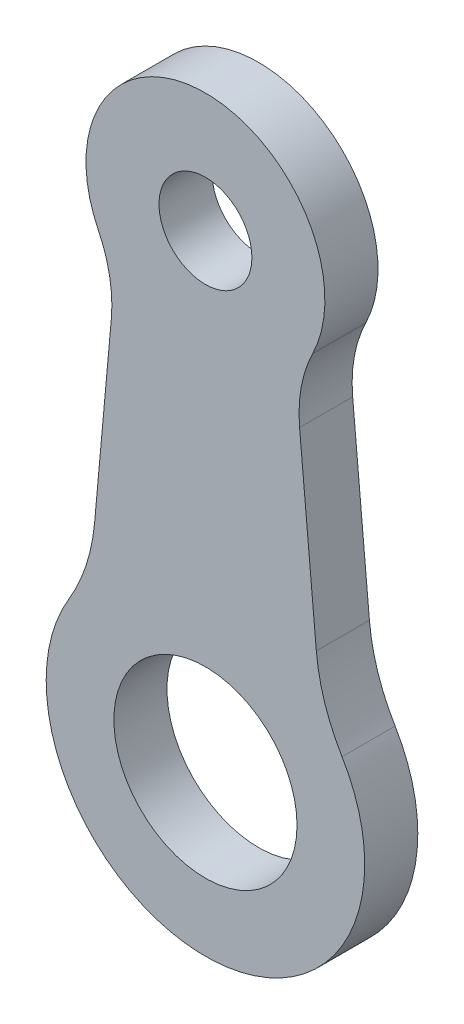
ISO-10303-21;
HEADER;
FILE_DESCRIPTION(('STEP AP214'),'2;1');
FILE_NAME('part.step','',(''),(''),'','','');
FILE_SCHEMA(('AUTOMOTIVE_DESIGN { 1 0 10303 214 1 1 1 1 }'));
ENDSEC;
DATA;
#1=APPLICATION_CONTEXT('core data for automotive mechanical design processes');
#2=APPLICATION_PROTOCOL_DEFINITION('international standard','automotive_design',2000,#1);
#3=PRODUCT_CONTEXT('',#1,'mechanical');
#4=PRODUCT('Part','Part','',(#3));
#5=PRODUCT_RELATED_PRODUCT_CATEGORY('part','',(#4));
#6=PRODUCT_DEFINITION_FORMATION('','',#4);
#7=PRODUCT_DEFINITION_CONTEXT('part definition',#1,'design');
#8=PRODUCT_DEFINITION('design','',#6,#7);
#9=PRODUCT_DEFINITION_SHAPE('','',#8);
#10=(LENGTH_UNIT() NAMED_UNIT(*) SI_UNIT(.MILLI.,.METRE.));
#11=(NAMED_UNIT(*) PLANE_ANGLE_UNIT() SI_UNIT($,.RADIAN.));
#12=(NAMED_UNIT(*) SI_UNIT($,.STERADIAN.) SOLID_ANGLE_UNIT());
#13=UNCERTAINTY_MEASURE_WITH_UNIT(LENGTH_MEASURE(1.E-05),#10,'distance_accuracy_value','');
#14=(GEOMETRIC_REPRESENTATION_CONTEXT(3) GLOBAL_UNCERTAINTY_ASSIGNED_CONTEXT((#13)) GLOBAL_UNIT_ASSIGNED_CONTEXT((#10,
#11,#12)) REPRESENTATION_CONTEXT('',''));
#15=CARTESIAN_POINT('',(0.,0.,0.));
#16=DIRECTION('',(0.,0.,1.));
#17=DIRECTION('',(1.,0.,0.));
#18=AXIS2_PLACEMENT_3D('',#15,#16,#17);
#19=CARTESIAN_POINT('',(8.5250451531391,13.477911601965,2.));
#20=DIRECTION('',(0.,0.,-1.));
#21=DIRECTION('',(-1.,0.,0.));
#22=AXIS2_PLACEMENT_3D('',#19,#20,#21);
#23=PLANE('',#22);
#24=CARTESIAN_POINT('',(8.5250451531391,13.477911601965,2.));
#25=DIRECTION('',(0.,0.,-1.));
#26=DIRECTION('',(-1.,0.,0.));
#27=AXIS2_PLACEMENT_3D('',#24,#25,#26);
#28=CIRCLE('',#27,5.);
#29=CARTESIAN_POINT('',(3.54541774275167,13.0270115534862,2.));
#30=VERTEX_POINT('',#29);
#31=CARTESIAN_POINT('',(4.03817928306589,15.6842739167203,2.));
#32=VERTEX_POINT('',#31);
#33=EDGE_CURVE('E146',#30,#32,#28,.T.);
#34=ORIENTED_EDGE('',*,*,#33,.T.);
#35=CARTESIAN_POINT('',(0.,17.67,2.));
#36=DIRECTION('',(0.,0.,1.));
#37=DIRECTION('',(1.,0.,0.));
#38=AXIS2_PLACEMENT_3D('',#35,#36,#37);
#39=CIRCLE('',#38,4.5);
#40=CARTESIAN_POINT('',(-4.03817928306589,15.6842739167203,2.));
#41=VERTEX_POINT('',#40);
#42=EDGE_CURVE('E94',#32,#41,#39,.T.);
#43=ORIENTED_EDGE('',*,*,#42,.T.);
#44=CARTESIAN_POINT('',(-8.5250451531391,13.477911601965,2.));
#45=DIRECTION('',(0.,0.,-1.));
#46=DIRECTION('',(1.,0.,0.));
#47=AXIS2_PLACEMENT_3D('',#44,#45,#46);
#48=CIRCLE('',#47,5.);
#49=CARTESIAN_POINT('',(-3.54541774275167,13.0270115534862,2.));
#50=VERTEX_POINT('',#49);
#51=EDGE_CURVE('E161',#41,#50,#48,.T.);
#52=ORIENTED_EDGE('',*,*,#51,.T.);
#53=DIRECTION('',(-0.0901800096957544,-0.995925482077486,0.));
#54=VECTOR('',#53,1.);
#55=CARTESIAN_POINT('',(-3.54541774275167,13.0270115534862,2.));
#56=LINE('',#55,#54);
#57=CARTESIAN_POINT('',(-4.17663467192244,6.05600959195654,2.));
#58=VERTEX_POINT('',#57);
#59=EDGE_CURVE('E174',#50,#58,#56,.T.);
#60=ORIENTED_EDGE('',*,*,#59,.T.);
#61=CARTESIAN_POINT('',(-11.1481130464648,6.68726965982682,2.));
#62=DIRECTION('',(0.,0.,-1.));
#63=DIRECTION('',(-1.,0.,0.));
#64=AXIS2_PLACEMENT_3D('',#61,#62,#63);
#65=CIRCLE('',#64,7.);
#66=CARTESIAN_POINT('',(-5.14528294452224,3.0864321506893,2.));
#67=VERTEX_POINT('',#66);
#68=EDGE_CURVE('E113',#58,#67,#65,.T.);
#69=ORIENTED_EDGE('',*,*,#68,.T.);
#70=CARTESIAN_POINT('',(0.,0.,2.));
#71=DIRECTION('',(0.,0.,1.));
#72=DIRECTION('',(1.,0.,0.));
#73=AXIS2_PLACEMENT_3D('',#70,#71,#72);
#74=CIRCLE('',#73,6.);
#75=CARTESIAN_POINT('',(5.14528294452224,3.0864321506893,2.));
#76=VERTEX_POINT('',#75);
#77=EDGE_CURVE('E107',#67,#76,#74,.T.);
#78=ORIENTED_EDGE('',*,*,#77,.T.);
#79=CARTESIAN_POINT('',(11.1481130464648,6.68726965982682,2.));
#80=DIRECTION('',(0.,0.,-1.));
#81=DIRECTION('',(1.,0.,0.));
#82=AXIS2_PLACEMENT_3D('',#79,#80,#81);
#83=CIRCLE('',#82,7.);
#84=CARTESIAN_POINT('',(4.17663467192244,6.05600959195654,2.));
#85=VERTEX_POINT('',#84);
#86=EDGE_CURVE('E111',#76,#85,#83,.T.);
#87=ORIENTED_EDGE('',*,*,#86,.T.);
#88=DIRECTION('',(-0.0901800096957544,0.995925482077486,0.));
#89=VECTOR('',#88,1.);
#90=CARTESIAN_POINT('',(3.54541774275167,13.0270115534862,2.));
#91=LINE('',#90,#89);
#92=EDGE_CURVE('E51',#85,#30,#91,.T.);
#93=ORIENTED_EDGE('',*,*,#92,.T.);
#94=EDGE_LOOP('',(#34,#43,#52,#60,#69,#78,#87,#93));
#95=FACE_BOUND('',#94,.T.);
#96=CARTESIAN_POINT('',(0.,17.67,2.));
#97=DIRECTION('',(0.,0.,1.));
#98=DIRECTION('',(1.,0.,0.));
#99=AXIS2_PLACEMENT_3D('',#96,#97,#98);
#100=CIRCLE('',#99,1.75);
#101=CARTESIAN_POINT('',(1.75,17.67,2.));
#102=VERTEX_POINT('',#101);
#103=EDGE_CURVE('E135',#102,#102,#100,.T.);
#104=ORIENTED_EDGE('',*,*,#103,.F.);
#105=EDGE_LOOP('',(#104));
#106=FACE_BOUND('',#105,.T.);
#107=CARTESIAN_POINT('',(0.,0.,2.));
#108=DIRECTION('',(0.,0.,1.));
#109=DIRECTION('',(1.,0.,0.));
#110=AXIS2_PLACEMENT_3D('',#107,#108,#109);
#111=CIRCLE('',#110,3.45);
#112=CARTESIAN_POINT('',(3.45,0.,2.));
#113=VERTEX_POINT('',#112);
#114=EDGE_CURVE('E183',#113,#113,#111,.T.);
#115=ORIENTED_EDGE('',*,*,#114,.F.);
#116=EDGE_LOOP('',(#115));
#117=FACE_BOUND('',#116,.T.);
#118=ADVANCED_FACE('F34',(#95,#106,#117),#23,.F.);
#119=CARTESIAN_POINT('',(8.5250451531391,13.477911601965,0.));
#120=DIRECTION('',(0.,0.,-1.));
#121=DIRECTION('',(-1.,0.,0.));
#122=AXIS2_PLACEMENT_3D('',#119,#120,#121);
#123=PLANE('',#122);
#124=CARTESIAN_POINT('',(0.,17.67,0.));
#125=DIRECTION('',(0.,0.,1.));
#126=DIRECTION('',(1.,0.,0.));
#127=AXIS2_PLACEMENT_3D('',#124,#125,#126);
#128=CIRCLE('',#127,1.75);
#129=CARTESIAN_POINT('',(1.75,17.67,0.));
#130=VERTEX_POINT('',#129);
#131=EDGE_CURVE('E180',#130,#130,#128,.T.);
#132=ORIENTED_EDGE('',*,*,#131,.T.);
#133=EDGE_LOOP('',(#132));
#134=FACE_BOUND('',#133,.T.);
#135=CARTESIAN_POINT('',(8.5250451531391,13.477911601965,0.));
#136=DIRECTION('',(0.,0.,-1.));
#137=DIRECTION('',(-1.,0.,0.));
#138=AXIS2_PLACEMENT_3D('',#135,#136,#137);
#139=CIRCLE('',#138,5.);
#140=CARTESIAN_POINT('',(3.54541774275167,13.0270115534862,0.));
#141=VERTEX_POINT('',#140);
#142=CARTESIAN_POINT('',(4.03817928306589,15.6842739167203,0.));
#143=VERTEX_POINT('',#142);
#144=EDGE_CURVE('E131',#141,#143,#139,.T.);
#145=ORIENTED_EDGE('',*,*,#144,.F.);
#146=DIRECTION('',(-0.0901800096957544,0.995925482077486,0.));
#147=VECTOR('',#146,1.);
#148=CARTESIAN_POINT('',(3.54541774275167,13.0270115534862,0.));
#149=LINE('',#148,#147);
#150=CARTESIAN_POINT('',(4.17663467192244,6.05600959195654,0.));
#151=VERTEX_POINT('',#150);
#152=EDGE_CURVE('E86',#151,#141,#149,.T.);
#153=ORIENTED_EDGE('',*,*,#152,.F.);
#154=CARTESIAN_POINT('',(11.1481130464648,6.68726965982682,0.));
#155=DIRECTION('',(0.,0.,-1.));
#156=DIRECTION('',(1.,0.,0.));
#157=AXIS2_PLACEMENT_3D('',#154,#155,#156);
#158=CIRCLE('',#157,7.);
#159=CARTESIAN_POINT('',(5.14528294452224,3.0864321506893,0.));
#160=VERTEX_POINT('',#159);
#161=EDGE_CURVE('E80',#160,#151,#158,.T.);
#162=ORIENTED_EDGE('',*,*,#161,.F.);
#163=CARTESIAN_POINT('',(0.,0.,0.));
#164=DIRECTION('',(0.,0.,1.));
#165=DIRECTION('',(1.,0.,0.));
#166=AXIS2_PLACEMENT_3D('',#163,#164,#165);
#167=CIRCLE('',#166,6.);
#168=CARTESIAN_POINT('',(-5.14528294452224,3.0864321506893,0.));
#169=VERTEX_POINT('',#168);
#170=EDGE_CURVE('E121',#169,#160,#167,.T.);
#171=ORIENTED_EDGE('',*,*,#170,.F.);
#172=CARTESIAN_POINT('',(-11.1481130464648,6.68726965982682,0.));
#173=DIRECTION('',(0.,0.,-1.));
#174=DIRECTION('',(-1.,0.,0.));
#175=AXIS2_PLACEMENT_3D('',#172,#173,#174);
#176=CIRCLE('',#175,7.);
#177=CARTESIAN_POINT('',(-4.17663467192244,6.05600959195654,0.));
#178=VERTEX_POINT('',#177);
#179=EDGE_CURVE('E141',#178,#169,#176,.T.);
#180=ORIENTED_EDGE('',*,*,#179,.F.);
#181=DIRECTION('',(-0.0901800096957544,-0.995925482077486,0.));
#182=VECTOR('',#181,1.);
#183=CARTESIAN_POINT('',(-3.54541774275167,13.0270115534862,0.));
#184=LINE('',#183,#182);
#185=CARTESIAN_POINT('',(-3.54541774275167,13.0270115534862,0.));
#186=VERTEX_POINT('',#185);
#187=EDGE_CURVE('E139',#186,#178,#184,.T.);
#188=ORIENTED_EDGE('',*,*,#187,.F.);
#189=CARTESIAN_POINT('',(-8.5250451531391,13.477911601965,0.));
#190=DIRECTION('',(0.,0.,-1.));
#191=DIRECTION('',(1.,0.,0.));
#192=AXIS2_PLACEMENT_3D('',#189,#190,#191);
#193=CIRCLE('',#192,5.);
#194=CARTESIAN_POINT('',(-4.03817928306589,15.6842739167203,0.));
#195=VERTEX_POINT('',#194);
#196=EDGE_CURVE('E137',#195,#186,#193,.T.);
#197=ORIENTED_EDGE('',*,*,#196,.F.);
#198=CARTESIAN_POINT('',(0.,17.67,0.));
#199=DIRECTION('',(0.,0.,1.));
#200=DIRECTION('',(1.,0.,0.));
#201=AXIS2_PLACEMENT_3D('',#198,#199,#200);
#202=CIRCLE('',#201,4.5);
#203=EDGE_CURVE('E134',#143,#195,#202,.T.);
#204=ORIENTED_EDGE('',*,*,#203,.F.);
#205=EDGE_LOOP('',(#145,#153,#162,#171,#180,#188,#197,#204));
#206=FACE_BOUND('',#205,.T.);
#207=CARTESIAN_POINT('',(0.,0.,0.));
#208=DIRECTION('',(0.,0.,1.));
#209=DIRECTION('',(1.,0.,0.));
#210=AXIS2_PLACEMENT_3D('',#207,#208,#209);
#211=CIRCLE('',#210,3.45);
#212=CARTESIAN_POINT('',(3.45,0.,0.));
#213=VERTEX_POINT('',#212);
#214=EDGE_CURVE('E186',#213,#213,#211,.T.);
#215=ORIENTED_EDGE('',*,*,#214,.T.);
#216=EDGE_LOOP('',(#215));
#217=FACE_BOUND('',#216,.T.);
#218=ADVANCED_FACE('F165',(#134,#206,#217),#123,.T.);
#219=CARTESIAN_POINT('',(8.5250451531391,13.477911601965,2.));
#220=DIRECTION('',(0.,0.,-1.));
#221=DIRECTION('',(-1.,0.,0.));
#222=AXIS2_PLACEMENT_3D('',#219,#220,#221);
#223=CYLINDRICAL_SURFACE('',#222,5.);
#224=ORIENTED_EDGE('',*,*,#144,.T.);
#225=DIRECTION('',(0.,0.,-1.));
#226=VECTOR('',#225,1.);
#227=CARTESIAN_POINT('',(4.03817928306589,15.6842739167203,2.));
#228=LINE('',#227,#226);
#229=EDGE_CURVE('E11',#32,#143,#228,.T.);
#230=ORIENTED_EDGE('',*,*,#229,.F.);
#231=ORIENTED_EDGE('',*,*,#33,.F.);
#232=DIRECTION('',(0.,0.,-1.));
#233=VECTOR('',#232,1.);
#234=CARTESIAN_POINT('',(3.54541774275167,13.0270115534862,2.));
#235=LINE('',#234,#233);
#236=EDGE_CURVE('E127',#30,#141,#235,.T.);
#237=ORIENTED_EDGE('',*,*,#236,.T.);
#238=EDGE_LOOP('',(#224,#230,#231,#237));
#239=FACE_BOUND('',#238,.T.);
#240=ADVANCED_FACE('F36',(#239),#223,.F.);
#241=CARTESIAN_POINT('',(0.,17.67,2.));
#242=DIRECTION('',(0.,0.,-1.));
#243=DIRECTION('',(-1.,0.,0.));
#244=AXIS2_PLACEMENT_3D('',#241,#242,#243);
#245=CYLINDRICAL_SURFACE('',#244,4.5);
#246=ORIENTED_EDGE('',*,*,#203,.T.);
#247=DIRECTION('',(0.,0.,-1.));
#248=VECTOR('',#247,1.);
#249=CARTESIAN_POINT('',(-4.03817928306589,15.6842739167203,2.));
#250=LINE('',#249,#248);
#251=EDGE_CURVE('E43',#41,#195,#250,.T.);
#252=ORIENTED_EDGE('',*,*,#251,.F.);
#253=ORIENTED_EDGE('',*,*,#42,.F.);
#254=ORIENTED_EDGE('',*,*,#229,.T.);
#255=EDGE_LOOP('',(#246,#252,#253,#254));
#256=FACE_BOUND('',#255,.T.);
#257=ADVANCED_FACE('F218',(#256),#245,.T.);
#258=CARTESIAN_POINT('',(-8.5250451531391,13.477911601965,2.));
#259=DIRECTION('',(0.,0.,-1.));
#260=DIRECTION('',(-1.,0.,0.));
#261=AXIS2_PLACEMENT_3D('',#258,#259,#260);
#262=CYLINDRICAL_SURFACE('',#261,5.);
#263=ORIENTED_EDGE('',*,*,#196,.T.);
#264=DIRECTION('',(0.,0.,-1.));
#265=VECTOR('',#264,1.);
#266=CARTESIAN_POINT('',(-3.54541774275167,13.0270115534862,2.));
#267=LINE('',#266,#265);
#268=EDGE_CURVE('E153',#50,#186,#267,.T.);
#269=ORIENTED_EDGE('',*,*,#268,.F.);
#270=ORIENTED_EDGE('',*,*,#51,.F.);
#271=ORIENTED_EDGE('',*,*,#251,.T.);
#272=EDGE_LOOP('',(#263,#269,#270,#271));
#273=FACE_BOUND('',#272,.T.);
#274=ADVANCED_FACE('F159',(#273),#262,.F.);
#275=CARTESIAN_POINT('',(-3.54541774275167,13.0270115534862,2.));
#276=DIRECTION('',(0.995925482077486,-0.0901800096957544,0.));
#277=DIRECTION('',(0.0901800096957544,0.995925482077487,0.));
#278=AXIS2_PLACEMENT_3D('',#275,#276,#277);
#279=PLANE('',#278);
#280=ORIENTED_EDGE('',*,*,#187,.T.);
#281=DIRECTION('',(0.,0.,-1.));
#282=VECTOR('',#281,1.);
#283=CARTESIAN_POINT('',(-4.17663467192244,6.05600959195654,2.));
#284=LINE('',#283,#282);
#285=EDGE_CURVE('E150',#58,#178,#284,.T.);
#286=ORIENTED_EDGE('',*,*,#285,.F.);
#287=ORIENTED_EDGE('',*,*,#59,.F.);
#288=ORIENTED_EDGE('',*,*,#268,.T.);
#289=EDGE_LOOP('',(#280,#286,#287,#288));
#290=FACE_BOUND('',#289,.T.);
#291=ADVANCED_FACE('F170',(#290),#279,.F.);
#292=CARTESIAN_POINT('',(-11.1481130464648,6.68726965982682,2.));
#293=DIRECTION('',(0.,0.,-1.));
#294=DIRECTION('',(-1.,0.,0.));
#295=AXIS2_PLACEMENT_3D('',#292,#293,#294);
#296=CYLINDRICAL_SURFACE('',#295,7.);
#297=ORIENTED_EDGE('',*,*,#179,.T.);
#298=DIRECTION('',(0.,0.,-1.));
#299=VECTOR('',#298,1.);
#300=CARTESIAN_POINT('',(-5.14528294452224,3.0864321506893,2.));
#301=LINE('',#300,#299);
#302=EDGE_CURVE('E122',#67,#169,#301,.T.);
#303=ORIENTED_EDGE('',*,*,#302,.F.);
#304=ORIENTED_EDGE('',*,*,#68,.F.);
#305=ORIENTED_EDGE('',*,*,#285,.T.);
#306=EDGE_LOOP('',(#297,#303,#304,#305));
#307=FACE_BOUND('',#306,.T.);
#308=ADVANCED_FACE('F173',(#307),#296,.F.);
#309=CARTESIAN_POINT('',(0.,0.,2.));
#310=DIRECTION('',(0.,0.,-1.));
#311=DIRECTION('',(-1.,0.,0.));
#312=AXIS2_PLACEMENT_3D('',#309,#310,#311);
#313=CYLINDRICAL_SURFACE('',#312,6.);
#314=ORIENTED_EDGE('',*,*,#170,.T.);
#315=DIRECTION('',(0.,0.,-1.));
#316=VECTOR('',#315,1.);
#317=CARTESIAN_POINT('',(5.14528294452224,3.0864321506893,2.));
#318=LINE('',#317,#316);
#319=EDGE_CURVE('E118',#76,#160,#318,.T.);
#320=ORIENTED_EDGE('',*,*,#319,.F.);
#321=ORIENTED_EDGE('',*,*,#77,.F.);
#322=ORIENTED_EDGE('',*,*,#302,.T.);
#323=EDGE_LOOP('',(#314,#320,#321,#322));
#324=FACE_BOUND('',#323,.T.);
#325=ADVANCED_FACE('F119',(#324),#313,.T.);
#326=CARTESIAN_POINT('',(11.1481130464648,6.68726965982682,2.));
#327=DIRECTION('',(0.,0.,-1.));
#328=DIRECTION('',(-1.,0.,0.));
#329=AXIS2_PLACEMENT_3D('',#326,#327,#328);
#330=CYLINDRICAL_SURFACE('',#329,7.);
#331=ORIENTED_EDGE('',*,*,#161,.T.);
#332=DIRECTION('',(0.,0.,-1.));
#333=VECTOR('',#332,1.);
#334=CARTESIAN_POINT('',(4.17663467192244,6.05600959195654,2.));
#335=LINE('',#334,#333);
#336=EDGE_CURVE('E123',#85,#151,#335,.T.);
#337=ORIENTED_EDGE('',*,*,#336,.F.);
#338=ORIENTED_EDGE('',*,*,#86,.F.);
#339=ORIENTED_EDGE('',*,*,#319,.T.);
#340=EDGE_LOOP('',(#331,#337,#338,#339));
#341=FACE_BOUND('',#340,.T.);
#342=ADVANCED_FACE('F125',(#341),#330,.F.);
#343=CARTESIAN_POINT('',(3.54541774275167,13.0270115534862,2.));
#344=DIRECTION('',(-0.995925482077486,-0.0901800096957544,0.));
#345=DIRECTION('',(0.0901800096957544,-0.995925482077487,0.));
#346=AXIS2_PLACEMENT_3D('',#343,#344,#345);
#347=PLANE('',#346);
#348=ORIENTED_EDGE('',*,*,#152,.T.);
#349=ORIENTED_EDGE('',*,*,#236,.F.);
#350=ORIENTED_EDGE('',*,*,#92,.F.);
#351=ORIENTED_EDGE('',*,*,#336,.T.);
#352=EDGE_LOOP('',(#348,#349,#350,#351));
#353=FACE_BOUND('',#352,.T.);
#354=ADVANCED_FACE('F206',(#353),#347,.F.);
#355=CARTESIAN_POINT('',(0.,17.67,2.));
#356=DIRECTION('',(0.,0.,-1.));
#357=DIRECTION('',(-1.,0.,0.));
#358=AXIS2_PLACEMENT_3D('',#355,#356,#357);
#359=CYLINDRICAL_SURFACE('',#358,1.75);
#360=ORIENTED_EDGE('',*,*,#103,.T.);
#361=EDGE_LOOP('',(#360));
#362=FACE_BOUND('',#361,.T.);
#363=ORIENTED_EDGE('',*,*,#131,.F.);
#364=EDGE_LOOP('',(#363));
#365=FACE_BOUND('',#364,.T.);
#366=ADVANCED_FACE('F203',(#362,#365),#359,.F.);
#367=CARTESIAN_POINT('',(0.,0.,2.));
#368=DIRECTION('',(0.,0.,-1.));
#369=DIRECTION('',(-1.,0.,0.));
#370=AXIS2_PLACEMENT_3D('',#367,#368,#369);
#371=CYLINDRICAL_SURFACE('',#370,3.45);
#372=ORIENTED_EDGE('',*,*,#114,.T.);
#373=EDGE_LOOP('',(#372));
#374=FACE_BOUND('',#373,.T.);
#375=ORIENTED_EDGE('',*,*,#214,.F.);
#376=EDGE_LOOP('',(#375));
#377=FACE_BOUND('',#376,.T.);
#378=ADVANCED_FACE('F192',(#374,#377),#371,.F.);
#379=CLOSED_SHELL('',(#118,#218,#240,#257,#274,#291,#308,#325,#342,#354,#366,#378));
#380=MANIFOLD_SOLID_BREP('B2',#379);
#381=ADVANCED_BREP_SHAPE_REPRESENTATION('',(#18,#380),#14);
#382=SHAPE_DEFINITION_REPRESENTATION(#9,#381);
ENDSEC;
END-ISO-10303-21;
